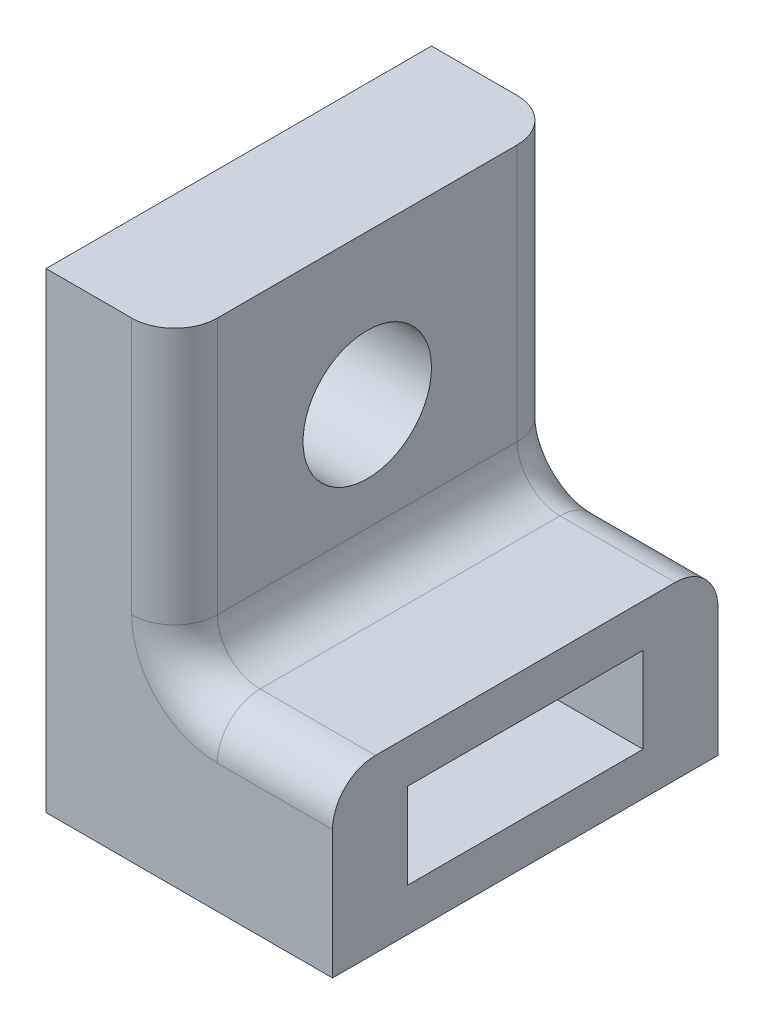
ISO-10303-21;
HEADER;
FILE_DESCRIPTION(('STEP AP214'),'2;1');
FILE_NAME('part.step','',(''),(''),'','','');
FILE_SCHEMA(('AUTOMOTIVE_DESIGN { 1 0 10303 214 1 1 1 1 }'));
ENDSEC;
DATA;
#1=APPLICATION_CONTEXT('core data for automotive mechanical design processes');
#2=APPLICATION_PROTOCOL_DEFINITION('international standard','automotive_design',2000,#1);
#3=PRODUCT_CONTEXT('',#1,'mechanical');
#4=PRODUCT('Part','Part','',(#3));
#5=PRODUCT_RELATED_PRODUCT_CATEGORY('part','',(#4));
#6=PRODUCT_DEFINITION_FORMATION('','',#4);
#7=PRODUCT_DEFINITION_CONTEXT('part definition',#1,'design');
#8=PRODUCT_DEFINITION('design','',#6,#7);
#9=PRODUCT_DEFINITION_SHAPE('','',#8);
#10=(LENGTH_UNIT() NAMED_UNIT(*) SI_UNIT(.MILLI.,.METRE.));
#11=(NAMED_UNIT(*) PLANE_ANGLE_UNIT() SI_UNIT($,.RADIAN.));
#12=(NAMED_UNIT(*) SI_UNIT($,.STERADIAN.) SOLID_ANGLE_UNIT());
#13=UNCERTAINTY_MEASURE_WITH_UNIT(LENGTH_MEASURE(1.E-05),#10,'distance_accuracy_value','');
#14=(GEOMETRIC_REPRESENTATION_CONTEXT(3) GLOBAL_UNCERTAINTY_ASSIGNED_CONTEXT((#13)) GLOBAL_UNIT_ASSIGNED_CONTEXT((#10,
#11,#12)) REPRESENTATION_CONTEXT('',''));
#15=CARTESIAN_POINT('',(0.,0.,0.));
#16=DIRECTION('',(0.,0.,1.));
#17=DIRECTION('',(1.,0.,0.));
#18=AXIS2_PLACEMENT_3D('',#15,#16,#17);
#19=CARTESIAN_POINT('',(0.,2.,0.));
#20=DIRECTION('',(0.,-1.,0.));
#21=DIRECTION('',(0.,0.,-1.));
#22=AXIS2_PLACEMENT_3D('',#19,#20,#21);
#23=PLANE('',#22);
#24=DIRECTION('',(1.,0.,0.));
#25=VECTOR('',#24,1.);
#26=CARTESIAN_POINT('',(1.5,2.,3.5));
#27=LINE('',#26,#25);
#28=CARTESIAN_POINT('',(-26.5,2.,3.5));
#29=VERTEX_POINT('',#28);
#30=CARTESIAN_POINT('',(-23.8113081010685,2.,3.5));
#31=VERTEX_POINT('',#30);
#32=EDGE_CURVE('E156',#29,#31,#27,.T.);
#33=ORIENTED_EDGE('',*,*,#32,.T.);
#34=DIRECTION('',(0.,0.,1.));
#35=VECTOR('',#34,1.);
#36=CARTESIAN_POINT('',(-23.8113081010685,2.,-5.72406777816781));
#37=LINE('',#36,#35);
#38=CARTESIAN_POINT('',(-23.8113081010685,2.,-3.5));
#39=VERTEX_POINT('',#38);
#40=EDGE_CURVE('E58',#39,#31,#37,.T.);
#41=ORIENTED_EDGE('',*,*,#40,.F.);
#42=DIRECTION('',(-1.,0.,0.));
#43=VECTOR('',#42,1.);
#44=CARTESIAN_POINT('',(-26.5,2.,-3.5));
#45=LINE('',#44,#43);
#46=CARTESIAN_POINT('',(-26.5,2.,-3.5));
#47=VERTEX_POINT('',#46);
#48=EDGE_CURVE('E153',#39,#47,#45,.T.);
#49=ORIENTED_EDGE('',*,*,#48,.T.);
#50=DIRECTION('',(0.,0.,-1.));
#51=VECTOR('',#50,1.);
#52=CARTESIAN_POINT('',(-26.5,2.,4.5));
#53=LINE('',#52,#51);
#54=EDGE_CURVE('E244',#47,#29,#53,.F.);
#55=ORIENTED_EDGE('',*,*,#54,.T.);
#56=EDGE_LOOP('',(#33,#41,#49,#55));
#57=FACE_BOUND('',#56,.T.);
#58=ADVANCED_FACE('F36',(#57),#23,.F.);
#59=CARTESIAN_POINT('',(0.,-2.,0.));
#60=DIRECTION('',(0.,-1.,0.));
#61=DIRECTION('',(0.,0.,-1.));
#62=AXIS2_PLACEMENT_3D('',#59,#60,#61);
#63=PLANE('',#62);
#64=DIRECTION('',(0.,0.,-1.));
#65=VECTOR('',#64,1.);
#66=CARTESIAN_POINT('',(-23.8113081010685,-2.,0.));
#67=LINE('',#66,#65);
#68=CARTESIAN_POINT('',(-23.8113081010685,-2.,4.5));
#69=VERTEX_POINT('',#68);
#70=CARTESIAN_POINT('',(-23.8113081010685,-2.,-4.5));
#71=VERTEX_POINT('',#70);
#72=EDGE_CURVE('E301',#69,#71,#67,.T.);
#73=ORIENTED_EDGE('',*,*,#72,.F.);
#74=DIRECTION('',(1.,0.,0.));
#75=VECTOR('',#74,1.);
#76=CARTESIAN_POINT('',(2.5,-2.,4.5));
#77=LINE('',#76,#75);
#78=CARTESIAN_POINT('',(-30.5,-2.,4.5));
#79=VERTEX_POINT('',#78);
#80=EDGE_CURVE('E233',#79,#69,#77,.T.);
#81=ORIENTED_EDGE('',*,*,#80,.F.);
#82=DIRECTION('',(0.,0.,1.));
#83=VECTOR('',#82,1.);
#84=CARTESIAN_POINT('',(-30.5,-2.,-4.5));
#85=LINE('',#84,#83);
#86=CARTESIAN_POINT('',(-30.5,-2.,-4.5));
#87=VERTEX_POINT('',#86);
#88=EDGE_CURVE('E230',#87,#79,#85,.T.);
#89=ORIENTED_EDGE('',*,*,#88,.F.);
#90=DIRECTION('',(-1.,0.,0.));
#91=VECTOR('',#90,1.);
#92=CARTESIAN_POINT('',(2.5,-2.,-4.5));
#93=LINE('',#92,#91);
#94=EDGE_CURVE('E223',#71,#87,#93,.T.);
#95=ORIENTED_EDGE('',*,*,#94,.F.);
#96=EDGE_LOOP('',(#73,#81,#89,#95));
#97=FACE_BOUND('',#96,.T.);
#98=ADVANCED_FACE('F337',(#97),#63,.T.);
#99=CARTESIAN_POINT('',(2.5,-2.,4.5));
#100=DIRECTION('',(0.,0.,1.));
#101=DIRECTION('',(1.,0.,0.));
#102=AXIS2_PLACEMENT_3D('',#99,#100,#101);
#103=PLANE('',#102);
#104=DIRECTION('',(0.,-1.,0.));
#105=VECTOR('',#104,1.);
#106=CARTESIAN_POINT('',(-23.8113081010685,-2.,4.5));
#107=LINE('',#106,#105);
#108=CARTESIAN_POINT('',(-23.8113081010685,1.,4.5));
#109=VERTEX_POINT('',#108);
#110=EDGE_CURVE('E157',#109,#69,#107,.T.);
#111=ORIENTED_EDGE('',*,*,#110,.F.);
#112=DIRECTION('',(1.,0.,0.));
#113=VECTOR('',#112,1.);
#114=CARTESIAN_POINT('',(-26.5,1.,4.5));
#115=LINE('',#114,#113);
#116=CARTESIAN_POINT('',(-26.5,1.,4.5));
#117=VERTEX_POINT('',#116);
#118=EDGE_CURVE('E251',#109,#117,#115,.F.);
#119=ORIENTED_EDGE('',*,*,#118,.T.);
#120=CARTESIAN_POINT('',(-26.5,3.,4.5));
#121=DIRECTION('',(0.,0.,1.));
#122=DIRECTION('',(1.,0.,0.));
#123=AXIS2_PLACEMENT_3D('',#120,#121,#122);
#124=CIRCLE('',#123,2.);
#125=CARTESIAN_POINT('',(-28.5,3.,4.5));
#126=VERTEX_POINT('',#125);
#127=EDGE_CURVE('E253',#117,#126,#124,.F.);
#128=ORIENTED_EDGE('',*,*,#127,.T.);
#129=DIRECTION('',(0.,-1.,0.));
#130=VECTOR('',#129,1.);
#131=CARTESIAN_POINT('',(-28.5,9.,4.5));
#132=LINE('',#131,#130);
#133=CARTESIAN_POINT('',(-28.5,9.,4.5));
#134=VERTEX_POINT('',#133);
#135=EDGE_CURVE('E255',#126,#134,#132,.F.);
#136=ORIENTED_EDGE('',*,*,#135,.T.);
#137=DIRECTION('',(1.,0.,0.));
#138=VECTOR('',#137,1.);
#139=CARTESIAN_POINT('',(-30.5,9.,4.5));
#140=LINE('',#139,#138);
#141=CARTESIAN_POINT('',(-30.5,9.,4.5));
#142=VERTEX_POINT('',#141);
#143=EDGE_CURVE('E200',#142,#134,#140,.T.);
#144=ORIENTED_EDGE('',*,*,#143,.F.);
#145=DIRECTION('',(0.,1.,0.));
#146=VECTOR('',#145,1.);
#147=CARTESIAN_POINT('',(-30.5,-2.,4.5));
#148=LINE('',#147,#146);
#149=EDGE_CURVE('E237',#79,#142,#148,.T.);
#150=ORIENTED_EDGE('',*,*,#149,.F.);
#151=ORIENTED_EDGE('',*,*,#80,.T.);
#152=EDGE_LOOP('',(#111,#119,#128,#136,#144,#150,#151));
#153=FACE_BOUND('',#152,.T.);
#154=ADVANCED_FACE('F299',(#153),#103,.T.);
#155=CARTESIAN_POINT('',(-30.5,-2.,-4.5));
#156=DIRECTION('',(-1.,0.,0.));
#157=DIRECTION('',(0.,0.,1.));
#158=AXIS2_PLACEMENT_3D('',#155,#156,#157);
#159=PLANE('',#158);
#160=CARTESIAN_POINT('',(-30.5,5.5,0.));
#161=DIRECTION('',(-1.,0.,0.));
#162=DIRECTION('',(0.,0.,1.));
#163=AXIS2_PLACEMENT_3D('',#160,#161,#162);
#164=CIRCLE('',#163,1.5);
#165=CARTESIAN_POINT('',(-30.5,5.5,1.50000000000001));
#166=VERTEX_POINT('',#165);
#167=EDGE_CURVE('E188',#166,#166,#164,.T.);
#168=ORIENTED_EDGE('',*,*,#167,.F.);
#169=EDGE_LOOP('',(#168));
#170=FACE_BOUND('',#169,.T.);
#171=DIRECTION('',(0.,1.,0.));
#172=VECTOR('',#171,1.);
#173=CARTESIAN_POINT('',(-30.5,1.,2.75));
#174=LINE('',#173,#172);
#175=CARTESIAN_POINT('',(-30.5,-1.,2.75));
#176=VERTEX_POINT('',#175);
#177=CARTESIAN_POINT('',(-30.5,1.,2.75));
#178=VERTEX_POINT('',#177);
#179=EDGE_CURVE('E208',#176,#178,#174,.T.);
#180=ORIENTED_EDGE('',*,*,#179,.F.);
#181=DIRECTION('',(0.,0.,1.));
#182=VECTOR('',#181,1.);
#183=CARTESIAN_POINT('',(-30.5,-1.,-2.75));
#184=LINE('',#183,#182);
#185=CARTESIAN_POINT('',(-30.5,-1.,-2.75));
#186=VERTEX_POINT('',#185);
#187=EDGE_CURVE('E217',#186,#176,#184,.T.);
#188=ORIENTED_EDGE('',*,*,#187,.F.);
#189=DIRECTION('',(0.,-1.,0.));
#190=VECTOR('',#189,1.);
#191=CARTESIAN_POINT('',(-30.5,1.,-2.75));
#192=LINE('',#191,#190);
#193=CARTESIAN_POINT('',(-30.5,1.,-2.75));
#194=VERTEX_POINT('',#193);
#195=EDGE_CURVE('E214',#194,#186,#192,.T.);
#196=ORIENTED_EDGE('',*,*,#195,.F.);
#197=DIRECTION('',(0.,0.,-1.));
#198=VECTOR('',#197,1.);
#199=CARTESIAN_POINT('',(-30.5,1.,-2.75));
#200=LINE('',#199,#198);
#201=EDGE_CURVE('E211',#178,#194,#200,.T.);
#202=ORIENTED_EDGE('',*,*,#201,.F.);
#203=EDGE_LOOP('',(#180,#188,#196,#202));
#204=FACE_BOUND('',#203,.T.);
#205=ORIENTED_EDGE('',*,*,#149,.T.);
#206=DIRECTION('',(0.,0.,1.));
#207=VECTOR('',#206,1.);
#208=CARTESIAN_POINT('',(-30.5,9.,-4.5));
#209=LINE('',#208,#207);
#210=CARTESIAN_POINT('',(-30.5,9.,-4.5));
#211=VERTEX_POINT('',#210);
#212=EDGE_CURVE('E193',#211,#142,#209,.T.);
#213=ORIENTED_EDGE('',*,*,#212,.F.);
#214=DIRECTION('',(0.,1.,0.));
#215=VECTOR('',#214,1.);
#216=CARTESIAN_POINT('',(-30.5,-2.,-4.5));
#217=LINE('',#216,#215);
#218=EDGE_CURVE('E236',#87,#211,#217,.T.);
#219=ORIENTED_EDGE('',*,*,#218,.F.);
#220=ORIENTED_EDGE('',*,*,#88,.T.);
#221=EDGE_LOOP('',(#205,#213,#219,#220));
#222=FACE_BOUND('',#221,.T.);
#223=ADVANCED_FACE('F281',(#170,#204,#222),#159,.T.);
#224=CARTESIAN_POINT('',(2.5,-2.,-4.5));
#225=DIRECTION('',(0.,0.,-1.));
#226=DIRECTION('',(-1.,0.,0.));
#227=AXIS2_PLACEMENT_3D('',#224,#225,#226);
#228=PLANE('',#227);
#229=DIRECTION('',(0.,1.,0.));
#230=VECTOR('',#229,1.);
#231=CARTESIAN_POINT('',(-23.8113081010685,-2.,-4.5));
#232=LINE('',#231,#230);
#233=CARTESIAN_POINT('',(-23.8113081010685,1.,-4.5));
#234=VERTEX_POINT('',#233);
#235=EDGE_CURVE('E143',#71,#234,#232,.T.);
#236=ORIENTED_EDGE('',*,*,#235,.F.);
#237=ORIENTED_EDGE('',*,*,#94,.T.);
#238=ORIENTED_EDGE('',*,*,#218,.T.);
#239=DIRECTION('',(-1.,0.,0.));
#240=VECTOR('',#239,1.);
#241=CARTESIAN_POINT('',(-30.5,9.,-4.5));
#242=LINE('',#241,#240);
#243=CARTESIAN_POINT('',(-28.5,9.,-4.5));
#244=VERTEX_POINT('',#243);
#245=EDGE_CURVE('E206',#244,#211,#242,.T.);
#246=ORIENTED_EDGE('',*,*,#245,.F.);
#247=DIRECTION('',(0.,-1.,0.));
#248=VECTOR('',#247,1.);
#249=CARTESIAN_POINT('',(-28.5,3.,-4.5));
#250=LINE('',#249,#248);
#251=CARTESIAN_POINT('',(-28.5,3.,-4.5));
#252=VERTEX_POINT('',#251);
#253=EDGE_CURVE('E44',#244,#252,#250,.T.);
#254=ORIENTED_EDGE('',*,*,#253,.T.);
#255=CARTESIAN_POINT('',(-26.5,3.,-4.5));
#256=DIRECTION('',(0.,0.,-1.));
#257=DIRECTION('',(-1.,0.,0.));
#258=AXIS2_PLACEMENT_3D('',#255,#256,#257);
#259=CIRCLE('',#258,2.);
#260=CARTESIAN_POINT('',(-26.5,1.,-4.5));
#261=VERTEX_POINT('',#260);
#262=EDGE_CURVE('E172',#252,#261,#259,.F.);
#263=ORIENTED_EDGE('',*,*,#262,.T.);
#264=DIRECTION('',(-1.,0.,0.));
#265=VECTOR('',#264,1.);
#266=CARTESIAN_POINT('',(1.5,1.,-4.5));
#267=LINE('',#266,#265);
#268=EDGE_CURVE('E165',#261,#234,#267,.F.);
#269=ORIENTED_EDGE('',*,*,#268,.T.);
#270=EDGE_LOOP('',(#236,#237,#238,#246,#254,#263,#269));
#271=FACE_BOUND('',#270,.T.);
#272=ADVANCED_FACE('F275',(#271),#228,.T.);
#273=CARTESIAN_POINT('',(-0.5,1.,2.75));
#274=DIRECTION('',(0.,0.,1.));
#275=DIRECTION('',(0.,-1.,0.));
#276=AXIS2_PLACEMENT_3D('',#273,#274,#275);
#277=PLANE('',#276);
#278=DIRECTION('',(-1.,0.,0.));
#279=VECTOR('',#278,1.);
#280=CARTESIAN_POINT('',(-0.5,1.,2.75));
#281=LINE('',#280,#279);
#282=CARTESIAN_POINT('',(-23.8113081010685,1.,2.75));
#283=VERTEX_POINT('',#282);
#284=EDGE_CURVE('E220',#283,#178,#281,.T.);
#285=ORIENTED_EDGE('',*,*,#284,.F.);
#286=DIRECTION('',(0.,-1.,0.));
#287=VECTOR('',#286,1.);
#288=CARTESIAN_POINT('',(-23.8113081010685,1.,2.75));
#289=LINE('',#288,#287);
#290=CARTESIAN_POINT('',(-23.8113081010685,-1.,2.75));
#291=VERTEX_POINT('',#290);
#292=EDGE_CURVE('E51',#283,#291,#289,.T.);
#293=ORIENTED_EDGE('',*,*,#292,.T.);
#294=DIRECTION('',(-1.,0.,0.));
#295=VECTOR('',#294,1.);
#296=CARTESIAN_POINT('',(-0.5,-1.,2.75));
#297=LINE('',#296,#295);
#298=EDGE_CURVE('E221',#291,#176,#297,.T.);
#299=ORIENTED_EDGE('',*,*,#298,.T.);
#300=ORIENTED_EDGE('',*,*,#179,.T.);
#301=EDGE_LOOP('',(#285,#293,#299,#300));
#302=FACE_BOUND('',#301,.T.);
#303=ADVANCED_FACE('F316',(#302),#277,.F.);
#304=CARTESIAN_POINT('',(-0.5,-1.,-2.75));
#305=DIRECTION('',(0.,-1.,0.));
#306=DIRECTION('',(0.,0.,-1.));
#307=AXIS2_PLACEMENT_3D('',#304,#305,#306);
#308=PLANE('',#307);
#309=ORIENTED_EDGE('',*,*,#298,.F.);
#310=DIRECTION('',(0.,0.,-1.));
#311=VECTOR('',#310,1.);
#312=CARTESIAN_POINT('',(-23.8113081010685,-1.,-2.75));
#313=LINE('',#312,#311);
#314=CARTESIAN_POINT('',(-23.8113081010685,-1.,-2.75));
#315=VERTEX_POINT('',#314);
#316=EDGE_CURVE('E309',#291,#315,#313,.T.);
#317=ORIENTED_EDGE('',*,*,#316,.T.);
#318=DIRECTION('',(-1.,0.,0.));
#319=VECTOR('',#318,1.);
#320=CARTESIAN_POINT('',(-0.5,-1.,-2.75));
#321=LINE('',#320,#319);
#322=EDGE_CURVE('E224',#315,#186,#321,.T.);
#323=ORIENTED_EDGE('',*,*,#322,.T.);
#324=ORIENTED_EDGE('',*,*,#187,.T.);
#325=EDGE_LOOP('',(#309,#317,#323,#324));
#326=FACE_BOUND('',#325,.T.);
#327=ADVANCED_FACE('F317',(#326),#308,.F.);
#328=CARTESIAN_POINT('',(-0.5,1.,-2.75));
#329=DIRECTION('',(0.,0.,-1.));
#330=DIRECTION('',(-1.,0.,0.));
#331=AXIS2_PLACEMENT_3D('',#328,#329,#330);
#332=PLANE('',#331);
#333=ORIENTED_EDGE('',*,*,#322,.F.);
#334=DIRECTION('',(0.,1.,0.));
#335=VECTOR('',#334,1.);
#336=CARTESIAN_POINT('',(-23.8113081010685,1.,-2.75));
#337=LINE('',#336,#335);
#338=CARTESIAN_POINT('',(-23.8113081010685,1.,-2.75));
#339=VERTEX_POINT('',#338);
#340=EDGE_CURVE('E307',#315,#339,#337,.T.);
#341=ORIENTED_EDGE('',*,*,#340,.T.);
#342=DIRECTION('',(-1.,0.,0.));
#343=VECTOR('',#342,1.);
#344=CARTESIAN_POINT('',(-0.5,1.,-2.75));
#345=LINE('',#344,#343);
#346=EDGE_CURVE('E226',#339,#194,#345,.T.);
#347=ORIENTED_EDGE('',*,*,#346,.T.);
#348=ORIENTED_EDGE('',*,*,#195,.T.);
#349=EDGE_LOOP('',(#333,#341,#347,#348));
#350=FACE_BOUND('',#349,.T.);
#351=ADVANCED_FACE('F327',(#350),#332,.F.);
#352=CARTESIAN_POINT('',(-0.5,1.,-2.75));
#353=DIRECTION('',(0.,1.,0.));
#354=DIRECTION('',(0.,0.,1.));
#355=AXIS2_PLACEMENT_3D('',#352,#353,#354);
#356=PLANE('',#355);
#357=ORIENTED_EDGE('',*,*,#346,.F.);
#358=DIRECTION('',(0.,0.,1.));
#359=VECTOR('',#358,1.);
#360=CARTESIAN_POINT('',(-23.8113081010685,1.,-2.75));
#361=LINE('',#360,#359);
#362=EDGE_CURVE('E148',#339,#283,#361,.T.);
#363=ORIENTED_EDGE('',*,*,#362,.T.);
#364=ORIENTED_EDGE('',*,*,#284,.T.);
#365=ORIENTED_EDGE('',*,*,#201,.T.);
#366=EDGE_LOOP('',(#357,#363,#364,#365));
#367=FACE_BOUND('',#366,.T.);
#368=ADVANCED_FACE('F325',(#367),#356,.F.);
#369=CARTESIAN_POINT('',(-27.5,9.,-4.5));
#370=DIRECTION('',(-1.,0.,0.));
#371=DIRECTION('',(0.,0.,1.));
#372=AXIS2_PLACEMENT_3D('',#369,#370,#371);
#373=PLANE('',#372);
#374=CARTESIAN_POINT('',(-27.5,5.5,0.));
#375=DIRECTION('',(1.,0.,0.));
#376=DIRECTION('',(0.,0.,-1.));
#377=AXIS2_PLACEMENT_3D('',#374,#375,#376);
#378=CIRCLE('',#377,1.5);
#379=CARTESIAN_POINT('',(-27.5,5.5,-1.49999999999999));
#380=VERTEX_POINT('',#379);
#381=EDGE_CURVE('E182',#380,#380,#378,.T.);
#382=ORIENTED_EDGE('',*,*,#381,.F.);
#383=EDGE_LOOP('',(#382));
#384=FACE_BOUND('',#383,.T.);
#385=DIRECTION('',(0.,0.,-1.));
#386=VECTOR('',#385,1.);
#387=CARTESIAN_POINT('',(-27.5,9.,-4.5));
#388=LINE('',#387,#386);
#389=CARTESIAN_POINT('',(-27.5,9.,3.5));
#390=VERTEX_POINT('',#389);
#391=CARTESIAN_POINT('',(-27.5,9.,-3.5));
#392=VERTEX_POINT('',#391);
#393=EDGE_CURVE('E203',#390,#392,#388,.T.);
#394=ORIENTED_EDGE('',*,*,#393,.F.);
#395=DIRECTION('',(0.,-1.,0.));
#396=VECTOR('',#395,1.);
#397=CARTESIAN_POINT('',(-27.5,3.,3.5));
#398=LINE('',#397,#396);
#399=CARTESIAN_POINT('',(-27.5,3.,3.5));
#400=VERTEX_POINT('',#399);
#401=EDGE_CURVE('E248',#390,#400,#398,.T.);
#402=ORIENTED_EDGE('',*,*,#401,.T.);
#403=DIRECTION('',(0.,0.,-1.));
#404=VECTOR('',#403,1.);
#405=CARTESIAN_POINT('',(-27.5,3.,-4.5));
#406=LINE('',#405,#404);
#407=CARTESIAN_POINT('',(-27.5,3.,-3.5));
#408=VERTEX_POINT('',#407);
#409=EDGE_CURVE('E239',#400,#408,#406,.T.);
#410=ORIENTED_EDGE('',*,*,#409,.T.);
#411=DIRECTION('',(0.,-1.,0.));
#412=VECTOR('',#411,1.);
#413=CARTESIAN_POINT('',(-27.5,9.,-3.5));
#414=LINE('',#413,#412);
#415=EDGE_CURVE('E246',#408,#392,#414,.F.);
#416=ORIENTED_EDGE('',*,*,#415,.T.);
#417=EDGE_LOOP('',(#394,#402,#410,#416));
#418=FACE_BOUND('',#417,.T.);
#419=ADVANCED_FACE('F266',(#384,#418),#373,.F.);
#420=CARTESIAN_POINT('',(0.,9.,0.));
#421=DIRECTION('',(0.,1.,0.));
#422=DIRECTION('',(0.,0.,1.));
#423=AXIS2_PLACEMENT_3D('',#420,#421,#422);
#424=PLANE('',#423);
#425=ORIENTED_EDGE('',*,*,#143,.T.);
#426=CARTESIAN_POINT('',(-28.5,9.,3.5));
#427=DIRECTION('',(0.,1.,0.));
#428=DIRECTION('',(0.,0.,1.));
#429=AXIS2_PLACEMENT_3D('',#426,#427,#428);
#430=CIRCLE('',#429,1.);
#431=EDGE_CURVE('E259',#134,#390,#430,.T.);
#432=ORIENTED_EDGE('',*,*,#431,.T.);
#433=ORIENTED_EDGE('',*,*,#393,.T.);
#434=CARTESIAN_POINT('',(-28.5,9.,-3.5));
#435=DIRECTION('',(0.,1.,0.));
#436=DIRECTION('',(0.,0.,1.));
#437=AXIS2_PLACEMENT_3D('',#434,#435,#436);
#438=CIRCLE('',#437,1.);
#439=EDGE_CURVE('E257',#392,#244,#438,.T.);
#440=ORIENTED_EDGE('',*,*,#439,.T.);
#441=ORIENTED_EDGE('',*,*,#245,.T.);
#442=ORIENTED_EDGE('',*,*,#212,.T.);
#443=EDGE_LOOP('',(#425,#432,#433,#440,#441,#442));
#444=FACE_BOUND('',#443,.T.);
#445=ADVANCED_FACE('F273',(#444),#424,.T.);
#446=CARTESIAN_POINT('',(-34.5,5.5,0.));
#447=DIRECTION('',(1.,0.,0.));
#448=DIRECTION('',(0.,0.,-1.));
#449=AXIS2_PLACEMENT_3D('',#446,#447,#448);
#450=CYLINDRICAL_SURFACE('',#449,1.5);
#451=ORIENTED_EDGE('',*,*,#167,.T.);
#452=EDGE_LOOP('',(#451));
#453=FACE_BOUND('',#452,.T.);
#454=ORIENTED_EDGE('',*,*,#381,.T.);
#455=EDGE_LOOP('',(#454));
#456=FACE_BOUND('',#455,.T.);
#457=ADVANCED_FACE('F356',(#453,#456),#450,.F.);
#458=CARTESIAN_POINT('',(-26.5,3.,-4.5));
#459=DIRECTION('',(0.,0.,1.));
#460=DIRECTION('',(1.,0.,0.));
#461=AXIS2_PLACEMENT_3D('',#458,#459,#460);
#462=CYLINDRICAL_SURFACE('',#461,1.);
#463=ORIENTED_EDGE('',*,*,#409,.F.);
#464=CARTESIAN_POINT('',(-26.5,3.,3.5));
#465=DIRECTION('',(0.,0.,1.));
#466=DIRECTION('',(1.,0.,0.));
#467=AXIS2_PLACEMENT_3D('',#464,#465,#466);
#468=CIRCLE('',#467,1.);
#469=EDGE_CURVE('E163',#400,#29,#468,.T.);
#470=ORIENTED_EDGE('',*,*,#469,.T.);
#471=ORIENTED_EDGE('',*,*,#54,.F.);
#472=CARTESIAN_POINT('',(-26.5,3.,-3.5));
#473=DIRECTION('',(0.,0.,-1.));
#474=DIRECTION('',(-1.,0.,0.));
#475=AXIS2_PLACEMENT_3D('',#472,#473,#474);
#476=CIRCLE('',#475,1.);
#477=EDGE_CURVE('E167',#47,#408,#476,.T.);
#478=ORIENTED_EDGE('',*,*,#477,.T.);
#479=EDGE_LOOP('',(#463,#470,#471,#478));
#480=FACE_BOUND('',#479,.T.);
#481=ADVANCED_FACE('F262',(#480),#462,.F.);
#482=CARTESIAN_POINT('',(-28.5,-2.,-3.5));
#483=DIRECTION('',(0.,1.,0.));
#484=DIRECTION('',(0.,0.,1.));
#485=AXIS2_PLACEMENT_3D('',#482,#483,#484);
#486=CYLINDRICAL_SURFACE('',#485,1.);
#487=ORIENTED_EDGE('',*,*,#439,.F.);
#488=ORIENTED_EDGE('',*,*,#415,.F.);
#489=CARTESIAN_POINT('',(-28.5,3.,-3.5));
#490=DIRECTION('',(0.,-1.,0.));
#491=DIRECTION('',(0.,0.,-1.));
#492=AXIS2_PLACEMENT_3D('',#489,#490,#491);
#493=CIRCLE('',#492,1.);
#494=EDGE_CURVE('E180',#252,#408,#493,.T.);
#495=ORIENTED_EDGE('',*,*,#494,.F.);
#496=ORIENTED_EDGE('',*,*,#253,.F.);
#497=EDGE_LOOP('',(#487,#488,#495,#496));
#498=FACE_BOUND('',#497,.T.);
#499=ADVANCED_FACE('F38',(#498),#486,.T.);
#500=CARTESIAN_POINT('',(-26.5,3.,-3.5));
#501=DIRECTION('',(0.,0.,-1.));
#502=DIRECTION('',(-1.,0.,0.));
#503=AXIS2_PLACEMENT_3D('',#500,#501,#502);
#504=TOROIDAL_SURFACE('',#503,2.,1.);
#505=ORIENTED_EDGE('',*,*,#494,.T.);
#506=ORIENTED_EDGE('',*,*,#477,.F.);
#507=CARTESIAN_POINT('',(-26.5,1.,-3.5));
#508=DIRECTION('',(1.,0.,0.));
#509=DIRECTION('',(0.,0.,-1.));
#510=AXIS2_PLACEMENT_3D('',#507,#508,#509);
#511=CIRCLE('',#510,1.);
#512=EDGE_CURVE('E162',#261,#47,#511,.T.);
#513=ORIENTED_EDGE('',*,*,#512,.F.);
#514=ORIENTED_EDGE('',*,*,#262,.F.);
#515=EDGE_LOOP('',(#505,#506,#513,#514));
#516=FACE_BOUND('',#515,.T.);
#517=ADVANCED_FACE('F364',(#516),#504,.T.);
#518=CARTESIAN_POINT('',(0.,1.,-3.5));
#519=DIRECTION('',(1.,0.,0.));
#520=DIRECTION('',(0.,0.,-1.));
#521=AXIS2_PLACEMENT_3D('',#518,#519,#520);
#522=CYLINDRICAL_SURFACE('',#521,1.);
#523=CARTESIAN_POINT('',(-23.8113081010685,1.,-3.5));
#524=DIRECTION('',(-1.,0.,0.));
#525=DIRECTION('',(0.,0.,1.));
#526=AXIS2_PLACEMENT_3D('',#523,#524,#525);
#527=CIRCLE('',#526,1.);
#528=EDGE_CURVE('E140',#234,#39,#527,.F.);
#529=ORIENTED_EDGE('',*,*,#528,.F.);
#530=ORIENTED_EDGE('',*,*,#268,.F.);
#531=ORIENTED_EDGE('',*,*,#512,.T.);
#532=ORIENTED_EDGE('',*,*,#48,.F.);
#533=EDGE_LOOP('',(#529,#530,#531,#532));
#534=FACE_BOUND('',#533,.T.);
#535=ADVANCED_FACE('F160',(#534),#522,.T.);
#536=CARTESIAN_POINT('',(0.,1.,3.5));
#537=DIRECTION('',(-1.,0.,0.));
#538=DIRECTION('',(0.,0.,1.));
#539=AXIS2_PLACEMENT_3D('',#536,#537,#538);
#540=CYLINDRICAL_SURFACE('',#539,1.);
#541=CARTESIAN_POINT('',(-23.8113081010685,1.,3.5));
#542=DIRECTION('',(-1.,0.,0.));
#543=DIRECTION('',(0.,0.,1.));
#544=AXIS2_PLACEMENT_3D('',#541,#542,#543);
#545=CIRCLE('',#544,1.);
#546=EDGE_CURVE('E11',#31,#109,#545,.F.);
#547=ORIENTED_EDGE('',*,*,#546,.F.);
#548=ORIENTED_EDGE('',*,*,#32,.F.);
#549=CARTESIAN_POINT('',(-26.5,1.,3.5));
#550=DIRECTION('',(-1.,0.,0.));
#551=DIRECTION('',(0.,0.,1.));
#552=AXIS2_PLACEMENT_3D('',#549,#550,#551);
#553=CIRCLE('',#552,1.);
#554=EDGE_CURVE('E177',#117,#29,#553,.T.);
#555=ORIENTED_EDGE('',*,*,#554,.F.);
#556=ORIENTED_EDGE('',*,*,#118,.F.);
#557=EDGE_LOOP('',(#547,#548,#555,#556));
#558=FACE_BOUND('',#557,.T.);
#559=ADVANCED_FACE('F295',(#558),#540,.T.);
#560=CARTESIAN_POINT('',(-26.5,3.,3.5));
#561=DIRECTION('',(0.,0.,1.));
#562=DIRECTION('',(1.,0.,0.));
#563=AXIS2_PLACEMENT_3D('',#560,#561,#562);
#564=TOROIDAL_SURFACE('',#563,2.,1.);
#565=ORIENTED_EDGE('',*,*,#554,.T.);
#566=ORIENTED_EDGE('',*,*,#469,.F.);
#567=CARTESIAN_POINT('',(-28.5,3.,3.5));
#568=DIRECTION('',(0.,1.,0.));
#569=DIRECTION('',(0.,0.,1.));
#570=AXIS2_PLACEMENT_3D('',#567,#568,#569);
#571=CIRCLE('',#570,1.);
#572=EDGE_CURVE('E175',#126,#400,#571,.T.);
#573=ORIENTED_EDGE('',*,*,#572,.F.);
#574=ORIENTED_EDGE('',*,*,#127,.F.);
#575=EDGE_LOOP('',(#565,#566,#573,#574));
#576=FACE_BOUND('',#575,.T.);
#577=ADVANCED_FACE('F292',(#576),#564,.T.);
#578=CARTESIAN_POINT('',(-28.5,9.,3.5));
#579=DIRECTION('',(0.,1.,0.));
#580=DIRECTION('',(0.,0.,1.));
#581=AXIS2_PLACEMENT_3D('',#578,#579,#580);
#582=CYLINDRICAL_SURFACE('',#581,1.);
#583=ORIENTED_EDGE('',*,*,#431,.F.);
#584=ORIENTED_EDGE('',*,*,#135,.F.);
#585=ORIENTED_EDGE('',*,*,#572,.T.);
#586=ORIENTED_EDGE('',*,*,#401,.F.);
#587=EDGE_LOOP('',(#583,#584,#585,#586));
#588=FACE_BOUND('',#587,.T.);
#589=ADVANCED_FACE('F287',(#588),#582,.T.);
#590=CARTESIAN_POINT('',(-23.8113081010685,-8.,-5.72406777816781));
#591=DIRECTION('',(-1.,0.,0.));
#592=DIRECTION('',(0.,0.,1.));
#593=AXIS2_PLACEMENT_3D('',#590,#591,#592);
#594=PLANE('',#593);
#595=ORIENTED_EDGE('',*,*,#528,.T.);
#596=ORIENTED_EDGE('',*,*,#40,.T.);
#597=ORIENTED_EDGE('',*,*,#546,.T.);
#598=ORIENTED_EDGE('',*,*,#110,.T.);
#599=ORIENTED_EDGE('',*,*,#72,.T.);
#600=ORIENTED_EDGE('',*,*,#235,.T.);
#601=EDGE_LOOP('',(#595,#596,#597,#598,#599,#600));
#602=FACE_BOUND('',#601,.T.);
#603=ORIENTED_EDGE('',*,*,#362,.F.);
#604=ORIENTED_EDGE('',*,*,#340,.F.);
#605=ORIENTED_EDGE('',*,*,#316,.F.);
#606=ORIENTED_EDGE('',*,*,#292,.F.);
#607=EDGE_LOOP('',(#603,#604,#605,#606));
#608=FACE_BOUND('',#607,.T.);
#609=ADVANCED_FACE('F141',(#602,#608),#594,.F.);
#610=CLOSED_SHELL('',(#58,#98,#154,#223,#272,#303,#327,#351,#368,#419,#445,#457,#481,#499,#517,
#535,#559,#577,#589,#609));
#611=MANIFOLD_SOLID_BREP('B2',#610);
#612=ADVANCED_BREP_SHAPE_REPRESENTATION('',(#18,#611),#14);
#613=SHAPE_DEFINITION_REPRESENTATION(#9,#612);
ENDSEC;
END-ISO-10303-21;
